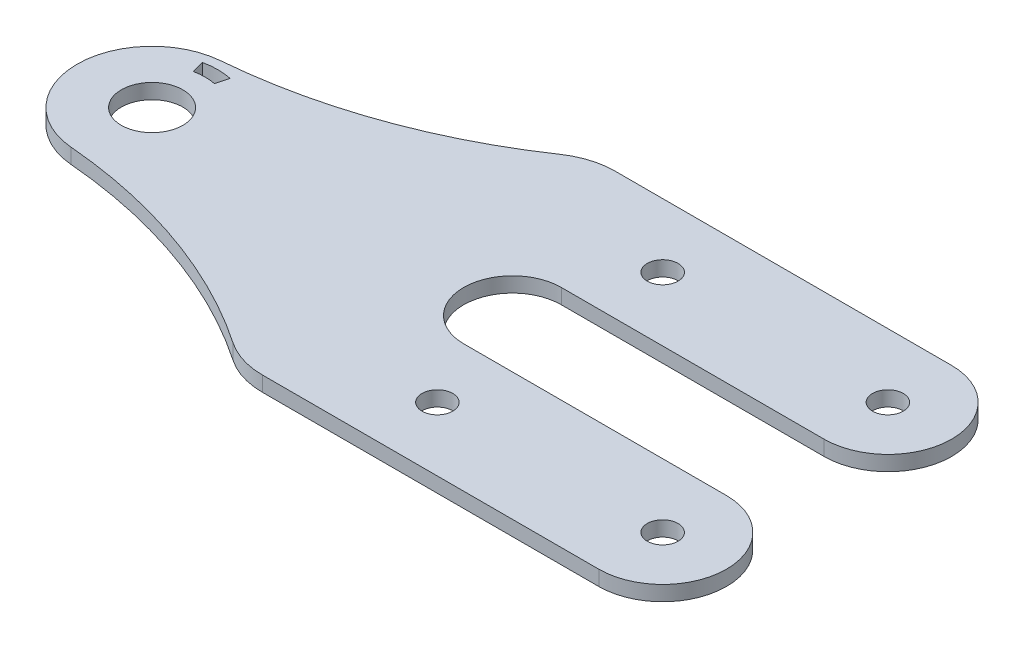
ISO-10303-21;
HEADER;
FILE_DESCRIPTION(('STEP AP214'),'2;1');
FILE_NAME('part.step','',(''),(''),'','','');
FILE_SCHEMA(('AUTOMOTIVE_DESIGN { 1 0 10303 214 1 1 1 1 }'));
ENDSEC;
DATA;
#1=APPLICATION_CONTEXT('core data for automotive mechanical design processes');
#2=APPLICATION_PROTOCOL_DEFINITION('international standard','automotive_design',2000,#1);
#3=PRODUCT_CONTEXT('',#1,'mechanical');
#4=PRODUCT('Part','Part','',(#3));
#5=PRODUCT_RELATED_PRODUCT_CATEGORY('part','',(#4));
#6=PRODUCT_DEFINITION_FORMATION('','',#4);
#7=PRODUCT_DEFINITION_CONTEXT('part definition',#1,'design');
#8=PRODUCT_DEFINITION('design','',#6,#7);
#9=PRODUCT_DEFINITION_SHAPE('','',#8);
#10=(LENGTH_UNIT() NAMED_UNIT(*) SI_UNIT(.MILLI.,.METRE.));
#11=(NAMED_UNIT(*) PLANE_ANGLE_UNIT() SI_UNIT($,.RADIAN.));
#12=(NAMED_UNIT(*) SI_UNIT($,.STERADIAN.) SOLID_ANGLE_UNIT());
#13=UNCERTAINTY_MEASURE_WITH_UNIT(LENGTH_MEASURE(1.E-05),#10,'distance_accuracy_value','');
#14=(GEOMETRIC_REPRESENTATION_CONTEXT(3) GLOBAL_UNCERTAINTY_ASSIGNED_CONTEXT((#13)) GLOBAL_UNIT_ASSIGNED_CONTEXT((#10,
#11,#12)) REPRESENTATION_CONTEXT('',''));
#15=CARTESIAN_POINT('',(0.,0.,0.));
#16=DIRECTION('',(0.,0.,1.));
#17=DIRECTION('',(1.,0.,0.));
#18=AXIS2_PLACEMENT_3D('',#15,#16,#17);
#19=CARTESIAN_POINT('',(0.,2.,0.));
#20=DIRECTION('',(0.,1.,0.));
#21=DIRECTION('',(0.,0.,1.));
#22=AXIS2_PLACEMENT_3D('',#19,#20,#21);
#23=PLANE('',#22);
#24=CARTESIAN_POINT('',(0.,2.,0.));
#25=DIRECTION('',(0.,1.,0.));
#26=DIRECTION('',(0.,0.,1.));
#27=AXIS2_PLACEMENT_3D('',#24,#25,#26);
#28=CIRCLE('',#27,8.75);
#29=CARTESIAN_POINT('',(1.84067203226459,2.,-8.55420519216362));
#30=VERTEX_POINT('',#29);
#31=CARTESIAN_POINT('',(-1.84067203226459,2.,-8.55420519216362));
#32=VERTEX_POINT('',#31);
#33=EDGE_CURVE('E155',#30,#32,#28,.T.);
#34=ORIENTED_EDGE('',*,*,#33,.F.);
#35=DIRECTION('',(0.258819045102521,0.,-0.965925826289068));
#36=VECTOR('',#35,1.);
#37=CARTESIAN_POINT('',(1.84067203226459,2.,-8.55420519216362));
#38=LINE('',#37,#36);
#39=CARTESIAN_POINT('',(1.4,2.,-6.90959477827752));
#40=VERTEX_POINT('',#39);
#41=EDGE_CURVE('E173',#40,#30,#38,.T.);
#42=ORIENTED_EDGE('',*,*,#41,.F.);
#43=CARTESIAN_POINT('',(0.,2.,0.));
#44=DIRECTION('',(0.,-1.,0.));
#45=DIRECTION('',(0.,0.,1.));
#46=AXIS2_PLACEMENT_3D('',#43,#44,#45);
#47=CIRCLE('',#46,7.05);
#48=CARTESIAN_POINT('',(-1.4,2.,-6.90959477827752));
#49=VERTEX_POINT('',#48);
#50=EDGE_CURVE('E176',#49,#40,#47,.T.);
#51=ORIENTED_EDGE('',*,*,#50,.F.);
#52=DIRECTION('',(0.258819045102521,0.,0.965925826289068));
#53=VECTOR('',#52,1.);
#54=CARTESIAN_POINT('',(-1.84067203226459,2.,-8.55420519216362));
#55=LINE('',#54,#53);
#56=EDGE_CURVE('E182',#32,#49,#55,.T.);
#57=ORIENTED_EDGE('',*,*,#56,.F.);
#58=EDGE_LOOP('',(#34,#42,#51,#57));
#59=FACE_BOUND('',#58,.T.);
#60=CARTESIAN_POINT('',(53.,2.,15.));
#61=DIRECTION('',(0.,1.,0.));
#62=DIRECTION('',(0.,0.,1.));
#63=AXIS2_PLACEMENT_3D('',#60,#61,#62);
#64=CIRCLE('',#63,2.05);
#65=CARTESIAN_POINT('',(53.,2.,17.05));
#66=VERTEX_POINT('',#65);
#67=EDGE_CURVE('E198',#66,#66,#64,.T.);
#68=ORIENTED_EDGE('',*,*,#67,.F.);
#69=EDGE_LOOP('',(#68));
#70=FACE_BOUND('',#69,.T.);
#71=CARTESIAN_POINT('',(53.,2.,-15.));
#72=DIRECTION('',(0.,1.,0.));
#73=DIRECTION('',(0.,0.,1.));
#74=AXIS2_PLACEMENT_3D('',#71,#72,#73);
#75=CIRCLE('',#74,2.04999999999999);
#76=CARTESIAN_POINT('',(53.,2.,-12.95));
#77=VERTEX_POINT('',#76);
#78=EDGE_CURVE('E210',#77,#77,#75,.T.);
#79=ORIENTED_EDGE('',*,*,#78,.F.);
#80=EDGE_LOOP('',(#79));
#81=FACE_BOUND('',#80,.T.);
#82=CARTESIAN_POINT('',(-6.70730685117692,2.,79.7183293528167));
#83=DIRECTION('',(0.,1.,0.));
#84=DIRECTION('',(0.,0.,1.));
#85=AXIS2_PLACEMENT_3D('',#82,#83,#84);
#86=CIRCLE('',#85,70.);
#87=CARTESIAN_POINT('',(-0.838413356397115,2.,9.96479116910209));
#88=VERTEX_POINT('',#87);
#89=CARTESIAN_POINT('',(32.5716454540123,2.,21.7772911691021));
#90=VERTEX_POINT('',#89);
#91=EDGE_CURVE('E285',#88,#90,#86,.F.);
#92=ORIENTED_EDGE('',*,*,#91,.T.);
#93=CARTESIAN_POINT('',(38.1829243547536,2.,13.5));
#94=DIRECTION('',(0.,1.,0.));
#95=DIRECTION('',(0.,0.,1.));
#96=AXIS2_PLACEMENT_3D('',#93,#94,#95);
#97=CIRCLE('',#96,10.);
#98=CARTESIAN_POINT('',(38.1829243547536,2.,23.5));
#99=VERTEX_POINT('',#98);
#100=EDGE_CURVE('E298',#90,#99,#97,.T.);
#101=ORIENTED_EDGE('',*,*,#100,.T.);
#102=DIRECTION('',(1.,0.,0.));
#103=VECTOR('',#102,1.);
#104=CARTESIAN_POINT('',(35.,2.,23.5));
#105=LINE('',#104,#103);
#106=CARTESIAN_POINT('',(83.,2.,23.5));
#107=VERTEX_POINT('',#106);
#108=EDGE_CURVE('E225',#99,#107,#105,.T.);
#109=ORIENTED_EDGE('',*,*,#108,.T.);
#110=CARTESIAN_POINT('',(83.,2.,15.));
#111=DIRECTION('',(0.,1.,0.));
#112=DIRECTION('',(0.,0.,1.));
#113=AXIS2_PLACEMENT_3D('',#110,#111,#112);
#114=CIRCLE('',#113,8.5);
#115=CARTESIAN_POINT('',(83.,2.,6.5));
#116=VERTEX_POINT('',#115);
#117=EDGE_CURVE('E228',#107,#116,#114,.T.);
#118=ORIENTED_EDGE('',*,*,#117,.T.);
#119=DIRECTION('',(-1.,0.,0.));
#120=VECTOR('',#119,1.);
#121=CARTESIAN_POINT('',(83.,2.,6.5));
#122=LINE('',#121,#120);
#123=CARTESIAN_POINT('',(48.,2.,6.50000000000001));
#124=VERTEX_POINT('',#123);
#125=EDGE_CURVE('E230',#116,#124,#122,.T.);
#126=ORIENTED_EDGE('',*,*,#125,.T.);
#127=CARTESIAN_POINT('',(48.,2.,0.));
#128=DIRECTION('',(0.,-1.,0.));
#129=DIRECTION('',(0.,0.,1.));
#130=AXIS2_PLACEMENT_3D('',#127,#128,#129);
#131=CIRCLE('',#130,6.5);
#132=CARTESIAN_POINT('',(48.,2.,-6.5));
#133=VERTEX_POINT('',#132);
#134=EDGE_CURVE('E232',#124,#133,#131,.T.);
#135=ORIENTED_EDGE('',*,*,#134,.T.);
#136=DIRECTION('',(1.,0.,0.));
#137=VECTOR('',#136,1.);
#138=CARTESIAN_POINT('',(83.,2.,-6.5));
#139=LINE('',#138,#137);
#140=CARTESIAN_POINT('',(83.,2.,-6.5));
#141=VERTEX_POINT('',#140);
#142=EDGE_CURVE('E234',#133,#141,#139,.T.);
#143=ORIENTED_EDGE('',*,*,#142,.T.);
#144=CARTESIAN_POINT('',(83.,2.,-15.));
#145=DIRECTION('',(0.,1.,0.));
#146=DIRECTION('',(0.,0.,1.));
#147=AXIS2_PLACEMENT_3D('',#144,#145,#146);
#148=CIRCLE('',#147,8.5);
#149=CARTESIAN_POINT('',(83.,2.,-23.5));
#150=VERTEX_POINT('',#149);
#151=EDGE_CURVE('E236',#141,#150,#148,.T.);
#152=ORIENTED_EDGE('',*,*,#151,.T.);
#153=DIRECTION('',(-1.,0.,0.));
#154=VECTOR('',#153,1.);
#155=CARTESIAN_POINT('',(35.,2.,-23.5));
#156=LINE('',#155,#154);
#157=CARTESIAN_POINT('',(38.1829243547536,2.,-23.5));
#158=VERTEX_POINT('',#157);
#159=EDGE_CURVE('E238',#150,#158,#156,.T.);
#160=ORIENTED_EDGE('',*,*,#159,.T.);
#161=CARTESIAN_POINT('',(38.1829243547536,2.,-13.5));
#162=DIRECTION('',(0.,1.,0.));
#163=DIRECTION('',(0.,0.,1.));
#164=AXIS2_PLACEMENT_3D('',#161,#162,#163);
#165=CIRCLE('',#164,10.);
#166=CARTESIAN_POINT('',(32.5716454540122,2.,-21.7772911691021));
#167=VERTEX_POINT('',#166);
#168=EDGE_CURVE('E50',#158,#167,#165,.T.);
#169=ORIENTED_EDGE('',*,*,#168,.T.);
#170=CARTESIAN_POINT('',(-6.70730685117692,2.,-79.7183293528167));
#171=DIRECTION('',(0.,1.,0.));
#172=DIRECTION('',(0.,0.,1.));
#173=AXIS2_PLACEMENT_3D('',#170,#171,#172);
#174=CIRCLE('',#173,70.);
#175=CARTESIAN_POINT('',(-0.838413356397115,2.,-9.96479116910209));
#176=VERTEX_POINT('',#175);
#177=EDGE_CURVE('E281',#167,#176,#174,.F.);
#178=ORIENTED_EDGE('',*,*,#177,.T.);
#179=CARTESIAN_POINT('',(0.,2.,0.));
#180=DIRECTION('',(0.,1.,0.));
#181=DIRECTION('',(0.,0.,1.));
#182=AXIS2_PLACEMENT_3D('',#179,#180,#181);
#183=CIRCLE('',#182,10.);
#184=EDGE_CURVE('E222',#176,#88,#183,.T.);
#185=ORIENTED_EDGE('',*,*,#184,.T.);
#186=EDGE_LOOP('',(#92,#101,#109,#118,#126,#135,#143,#152,#160,#169,#178,#185));
#187=FACE_BOUND('',#186,.T.);
#188=CARTESIAN_POINT('',(0.,2.,0.));
#189=DIRECTION('',(0.,1.,0.));
#190=DIRECTION('',(0.,0.,1.));
#191=AXIS2_PLACEMENT_3D('',#188,#189,#190);
#192=CIRCLE('',#191,4.1);
#193=CARTESIAN_POINT('',(0.,2.,4.1));
#194=VERTEX_POINT('',#193);
#195=EDGE_CURVE('E216',#194,#194,#192,.T.);
#196=ORIENTED_EDGE('',*,*,#195,.F.);
#197=EDGE_LOOP('',(#196));
#198=FACE_BOUND('',#197,.T.);
#199=CARTESIAN_POINT('',(83.,2.,-15.));
#200=DIRECTION('',(0.,1.,0.));
#201=DIRECTION('',(0.,0.,1.));
#202=AXIS2_PLACEMENT_3D('',#199,#200,#201);
#203=CIRCLE('',#202,2.04999999999999);
#204=CARTESIAN_POINT('',(83.,2.,-12.95));
#205=VERTEX_POINT('',#204);
#206=EDGE_CURVE('E204',#205,#205,#203,.T.);
#207=ORIENTED_EDGE('',*,*,#206,.F.);
#208=EDGE_LOOP('',(#207));
#209=FACE_BOUND('',#208,.T.);
#210=CARTESIAN_POINT('',(83.,2.,15.));
#211=DIRECTION('',(0.,1.,0.));
#212=DIRECTION('',(0.,0.,1.));
#213=AXIS2_PLACEMENT_3D('',#210,#211,#212);
#214=CIRCLE('',#213,2.04999999999999);
#215=CARTESIAN_POINT('',(83.,2.,17.05));
#216=VERTEX_POINT('',#215);
#217=EDGE_CURVE('E192',#216,#216,#214,.T.);
#218=ORIENTED_EDGE('',*,*,#217,.F.);
#219=EDGE_LOOP('',(#218));
#220=FACE_BOUND('',#219,.T.);
#221=ADVANCED_FACE('F35',(#59,#70,#81,#187,#198,#209,#220),#23,.T.);
#222=CARTESIAN_POINT('',(0.,0.,0.));
#223=DIRECTION('',(0.,1.,0.));
#224=DIRECTION('',(0.,0.,1.));
#225=AXIS2_PLACEMENT_3D('',#222,#223,#224);
#226=PLANE('',#225);
#227=DIRECTION('',(0.258819045102521,0.,-0.965925826289068));
#228=VECTOR('',#227,1.);
#229=CARTESIAN_POINT('',(1.84067203226459,0.,-8.55420519216362));
#230=LINE('',#229,#228);
#231=CARTESIAN_POINT('',(1.4,0.,-6.90959477827752));
#232=VERTEX_POINT('',#231);
#233=CARTESIAN_POINT('',(1.84067203226459,0.,-8.55420519216362));
#234=VERTEX_POINT('',#233);
#235=EDGE_CURVE('E160',#232,#234,#230,.T.);
#236=ORIENTED_EDGE('',*,*,#235,.T.);
#237=CARTESIAN_POINT('',(0.,0.,0.));
#238=DIRECTION('',(0.,1.,0.));
#239=DIRECTION('',(0.,0.,1.));
#240=AXIS2_PLACEMENT_3D('',#237,#238,#239);
#241=CIRCLE('',#240,8.75);
#242=CARTESIAN_POINT('',(-1.84067203226459,0.,-8.55420519216362));
#243=VERTEX_POINT('',#242);
#244=EDGE_CURVE('E152',#234,#243,#241,.T.);
#245=ORIENTED_EDGE('',*,*,#244,.T.);
#246=DIRECTION('',(0.258819045102521,0.,0.965925826289068));
#247=VECTOR('',#246,1.);
#248=CARTESIAN_POINT('',(-1.84067203226459,0.,-8.55420519216362));
#249=LINE('',#248,#247);
#250=CARTESIAN_POINT('',(-1.4,0.,-6.90959477827752));
#251=VERTEX_POINT('',#250);
#252=EDGE_CURVE('E164',#243,#251,#249,.T.);
#253=ORIENTED_EDGE('',*,*,#252,.T.);
#254=CARTESIAN_POINT('',(0.,0.,0.));
#255=DIRECTION('',(0.,-1.,0.));
#256=DIRECTION('',(0.,0.,1.));
#257=AXIS2_PLACEMENT_3D('',#254,#255,#256);
#258=CIRCLE('',#257,7.05);
#259=EDGE_CURVE('E168',#251,#232,#258,.T.);
#260=ORIENTED_EDGE('',*,*,#259,.T.);
#261=EDGE_LOOP('',(#236,#245,#253,#260));
#262=FACE_BOUND('',#261,.T.);
#263=DIRECTION('',(1.,0.,0.));
#264=VECTOR('',#263,1.);
#265=CARTESIAN_POINT('',(35.,0.,23.5));
#266=LINE('',#265,#264);
#267=CARTESIAN_POINT('',(38.1829243547536,0.,23.5));
#268=VERTEX_POINT('',#267);
#269=CARTESIAN_POINT('',(83.,0.,23.5));
#270=VERTEX_POINT('',#269);
#271=EDGE_CURVE('E243',#268,#270,#266,.T.);
#272=ORIENTED_EDGE('',*,*,#271,.F.);
#273=CARTESIAN_POINT('',(38.1829243547536,0.,13.5));
#274=DIRECTION('',(0.,1.,0.));
#275=DIRECTION('',(0.,0.,1.));
#276=AXIS2_PLACEMENT_3D('',#273,#274,#275);
#277=CIRCLE('',#276,10.);
#278=CARTESIAN_POINT('',(32.5716454540123,0.,21.7772911691021));
#279=VERTEX_POINT('',#278);
#280=EDGE_CURVE('E293',#268,#279,#277,.F.);
#281=ORIENTED_EDGE('',*,*,#280,.T.);
#282=CARTESIAN_POINT('',(-6.70730685117692,0.,79.7183293528167));
#283=DIRECTION('',(0.,1.,0.));
#284=DIRECTION('',(0.,0.,1.));
#285=AXIS2_PLACEMENT_3D('',#282,#283,#284);
#286=CIRCLE('',#285,70.);
#287=CARTESIAN_POINT('',(-0.838413356397115,0.,9.96479116910209));
#288=VERTEX_POINT('',#287);
#289=EDGE_CURVE('E283',#279,#288,#286,.T.);
#290=ORIENTED_EDGE('',*,*,#289,.T.);
#291=CARTESIAN_POINT('',(0.,0.,0.));
#292=DIRECTION('',(0.,1.,0.));
#293=DIRECTION('',(0.,0.,1.));
#294=AXIS2_PLACEMENT_3D('',#291,#292,#293);
#295=CIRCLE('',#294,10.);
#296=CARTESIAN_POINT('',(-0.838413356397115,0.,-9.96479116910209));
#297=VERTEX_POINT('',#296);
#298=EDGE_CURVE('E219',#297,#288,#295,.T.);
#299=ORIENTED_EDGE('',*,*,#298,.F.);
#300=CARTESIAN_POINT('',(-6.70730685117692,0.,-79.7183293528167));
#301=DIRECTION('',(0.,1.,0.));
#302=DIRECTION('',(0.,0.,1.));
#303=AXIS2_PLACEMENT_3D('',#300,#301,#302);
#304=CIRCLE('',#303,70.);
#305=CARTESIAN_POINT('',(32.5716454540122,0.,-21.7772911691021));
#306=VERTEX_POINT('',#305);
#307=EDGE_CURVE('E278',#297,#306,#304,.T.);
#308=ORIENTED_EDGE('',*,*,#307,.T.);
#309=CARTESIAN_POINT('',(38.1829243547536,0.,-13.5));
#310=DIRECTION('',(0.,1.,0.));
#311=DIRECTION('',(0.,0.,1.));
#312=AXIS2_PLACEMENT_3D('',#309,#310,#311);
#313=CIRCLE('',#312,10.);
#314=CARTESIAN_POINT('',(38.1829243547536,0.,-23.5));
#315=VERTEX_POINT('',#314);
#316=EDGE_CURVE('E291',#306,#315,#313,.F.);
#317=ORIENTED_EDGE('',*,*,#316,.T.);
#318=DIRECTION('',(-1.,0.,0.));
#319=VECTOR('',#318,1.);
#320=CARTESIAN_POINT('',(35.,0.,-23.5));
#321=LINE('',#320,#319);
#322=CARTESIAN_POINT('',(83.,0.,-23.5));
#323=VERTEX_POINT('',#322);
#324=EDGE_CURVE('E226',#323,#315,#321,.T.);
#325=ORIENTED_EDGE('',*,*,#324,.F.);
#326=CARTESIAN_POINT('',(83.,0.,-15.));
#327=DIRECTION('',(0.,1.,0.));
#328=DIRECTION('',(0.,0.,1.));
#329=AXIS2_PLACEMENT_3D('',#326,#327,#328);
#330=CIRCLE('',#329,8.5);
#331=CARTESIAN_POINT('',(83.,0.,-6.5));
#332=VERTEX_POINT('',#331);
#333=EDGE_CURVE('E253',#332,#323,#330,.T.);
#334=ORIENTED_EDGE('',*,*,#333,.F.);
#335=DIRECTION('',(1.,0.,0.));
#336=VECTOR('',#335,1.);
#337=CARTESIAN_POINT('',(83.,0.,-6.5));
#338=LINE('',#337,#336);
#339=CARTESIAN_POINT('',(48.,0.,-6.5));
#340=VERTEX_POINT('',#339);
#341=EDGE_CURVE('E251',#340,#332,#338,.T.);
#342=ORIENTED_EDGE('',*,*,#341,.F.);
#343=CARTESIAN_POINT('',(48.,0.,0.));
#344=DIRECTION('',(0.,-1.,0.));
#345=DIRECTION('',(0.,0.,1.));
#346=AXIS2_PLACEMENT_3D('',#343,#344,#345);
#347=CIRCLE('',#346,6.5);
#348=CARTESIAN_POINT('',(48.,0.,6.50000000000001));
#349=VERTEX_POINT('',#348);
#350=EDGE_CURVE('E249',#349,#340,#347,.T.);
#351=ORIENTED_EDGE('',*,*,#350,.F.);
#352=DIRECTION('',(-1.,0.,0.));
#353=VECTOR('',#352,1.);
#354=CARTESIAN_POINT('',(83.,0.,6.5));
#355=LINE('',#354,#353);
#356=CARTESIAN_POINT('',(83.,0.,6.5));
#357=VERTEX_POINT('',#356);
#358=EDGE_CURVE('E247',#357,#349,#355,.T.);
#359=ORIENTED_EDGE('',*,*,#358,.F.);
#360=CARTESIAN_POINT('',(83.,0.,15.));
#361=DIRECTION('',(0.,1.,0.));
#362=DIRECTION('',(0.,0.,1.));
#363=AXIS2_PLACEMENT_3D('',#360,#361,#362);
#364=CIRCLE('',#363,8.5);
#365=EDGE_CURVE('E245',#270,#357,#364,.T.);
#366=ORIENTED_EDGE('',*,*,#365,.F.);
#367=EDGE_LOOP('',(#272,#281,#290,#299,#308,#317,#325,#334,#342,#351,#359,#366));
#368=FACE_BOUND('',#367,.T.);
#369=CARTESIAN_POINT('',(0.,0.,0.));
#370=DIRECTION('',(0.,1.,0.));
#371=DIRECTION('',(0.,0.,1.));
#372=AXIS2_PLACEMENT_3D('',#369,#370,#371);
#373=CIRCLE('',#372,4.1);
#374=CARTESIAN_POINT('',(0.,0.,4.1));
#375=VERTEX_POINT('',#374);
#376=EDGE_CURVE('E213',#375,#375,#373,.T.);
#377=ORIENTED_EDGE('',*,*,#376,.T.);
#378=EDGE_LOOP('',(#377));
#379=FACE_BOUND('',#378,.T.);
#380=CARTESIAN_POINT('',(53.,0.,-15.));
#381=DIRECTION('',(0.,1.,0.));
#382=DIRECTION('',(0.,0.,1.));
#383=AXIS2_PLACEMENT_3D('',#380,#381,#382);
#384=CIRCLE('',#383,2.04999999999999);
#385=CARTESIAN_POINT('',(53.,0.,-12.95));
#386=VERTEX_POINT('',#385);
#387=EDGE_CURVE('E207',#386,#386,#384,.T.);
#388=ORIENTED_EDGE('',*,*,#387,.T.);
#389=EDGE_LOOP('',(#388));
#390=FACE_BOUND('',#389,.T.);
#391=CARTESIAN_POINT('',(83.,0.,-15.));
#392=DIRECTION('',(0.,1.,0.));
#393=DIRECTION('',(0.,0.,1.));
#394=AXIS2_PLACEMENT_3D('',#391,#392,#393);
#395=CIRCLE('',#394,2.04999999999999);
#396=CARTESIAN_POINT('',(83.,0.,-12.95));
#397=VERTEX_POINT('',#396);
#398=EDGE_CURVE('E201',#397,#397,#395,.T.);
#399=ORIENTED_EDGE('',*,*,#398,.T.);
#400=EDGE_LOOP('',(#399));
#401=FACE_BOUND('',#400,.T.);
#402=CARTESIAN_POINT('',(53.,0.,15.));
#403=DIRECTION('',(0.,1.,0.));
#404=DIRECTION('',(0.,0.,1.));
#405=AXIS2_PLACEMENT_3D('',#402,#403,#404);
#406=CIRCLE('',#405,2.05);
#407=CARTESIAN_POINT('',(53.,0.,17.05));
#408=VERTEX_POINT('',#407);
#409=EDGE_CURVE('E195',#408,#408,#406,.T.);
#410=ORIENTED_EDGE('',*,*,#409,.T.);
#411=EDGE_LOOP('',(#410));
#412=FACE_BOUND('',#411,.T.);
#413=CARTESIAN_POINT('',(83.,0.,15.));
#414=DIRECTION('',(0.,1.,0.));
#415=DIRECTION('',(0.,0.,1.));
#416=AXIS2_PLACEMENT_3D('',#413,#414,#415);
#417=CIRCLE('',#416,2.04999999999999);
#418=CARTESIAN_POINT('',(83.,0.,17.05));
#419=VERTEX_POINT('',#418);
#420=EDGE_CURVE('E188',#419,#419,#417,.T.);
#421=ORIENTED_EDGE('',*,*,#420,.T.);
#422=EDGE_LOOP('',(#421));
#423=FACE_BOUND('',#422,.T.);
#424=ADVANCED_FACE('F170',(#262,#368,#379,#390,#401,#412,#423),#226,.F.);
#425=CARTESIAN_POINT('',(0.,2.,0.));
#426=DIRECTION('',(0.,-1.,0.));
#427=DIRECTION('',(0.,0.,-1.));
#428=AXIS2_PLACEMENT_3D('',#425,#426,#427);
#429=CYLINDRICAL_SURFACE('',#428,10.);
#430=ORIENTED_EDGE('',*,*,#184,.F.);
#431=DIRECTION('',(0.,-1.,0.));
#432=VECTOR('',#431,1.);
#433=CARTESIAN_POINT('',(-0.838413356397115,2.,-9.96479116910209));
#434=LINE('',#433,#432);
#435=EDGE_CURVE('E275',#176,#297,#434,.T.);
#436=ORIENTED_EDGE('',*,*,#435,.T.);
#437=ORIENTED_EDGE('',*,*,#298,.T.);
#438=DIRECTION('',(0.,-1.,0.));
#439=VECTOR('',#438,1.);
#440=CARTESIAN_POINT('',(-0.838413356397115,2.,9.96479116910209));
#441=LINE('',#440,#439);
#442=EDGE_CURVE('E273',#288,#88,#441,.F.);
#443=ORIENTED_EDGE('',*,*,#442,.T.);
#444=EDGE_LOOP('',(#430,#436,#437,#443));
#445=FACE_BOUND('',#444,.T.);
#446=ADVANCED_FACE('F313',(#445),#429,.T.);
#447=CARTESIAN_POINT('',(35.,2.,23.5));
#448=DIRECTION('',(0.,0.,-1.));
#449=DIRECTION('',(-1.,0.,0.));
#450=AXIS2_PLACEMENT_3D('',#447,#448,#449);
#451=PLANE('',#450);
#452=ORIENTED_EDGE('',*,*,#108,.F.);
#453=DIRECTION('',(0.,1.,0.));
#454=VECTOR('',#453,1.);
#455=CARTESIAN_POINT('',(38.1829243547536,2.,23.5));
#456=LINE('',#455,#454);
#457=EDGE_CURVE('E288',#99,#268,#456,.F.);
#458=ORIENTED_EDGE('',*,*,#457,.T.);
#459=ORIENTED_EDGE('',*,*,#271,.T.);
#460=DIRECTION('',(0.,-1.,0.));
#461=VECTOR('',#460,1.);
#462=CARTESIAN_POINT('',(83.,2.,23.5));
#463=LINE('',#462,#461);
#464=EDGE_CURVE('E270',#107,#270,#463,.T.);
#465=ORIENTED_EDGE('',*,*,#464,.F.);
#466=EDGE_LOOP('',(#452,#458,#459,#465));
#467=FACE_BOUND('',#466,.T.);
#468=ADVANCED_FACE('F325',(#467),#451,.F.);
#469=CARTESIAN_POINT('',(83.,2.,15.));
#470=DIRECTION('',(0.,-1.,0.));
#471=DIRECTION('',(0.,0.,-1.));
#472=AXIS2_PLACEMENT_3D('',#469,#470,#471);
#473=CYLINDRICAL_SURFACE('',#472,8.5);
#474=ORIENTED_EDGE('',*,*,#365,.T.);
#475=DIRECTION('',(0.,-1.,0.));
#476=VECTOR('',#475,1.);
#477=CARTESIAN_POINT('',(83.,2.,6.5));
#478=LINE('',#477,#476);
#479=EDGE_CURVE('E267',#116,#357,#478,.T.);
#480=ORIENTED_EDGE('',*,*,#479,.F.);
#481=ORIENTED_EDGE('',*,*,#117,.F.);
#482=ORIENTED_EDGE('',*,*,#464,.T.);
#483=EDGE_LOOP('',(#474,#480,#481,#482));
#484=FACE_BOUND('',#483,.T.);
#485=ADVANCED_FACE('F332',(#484),#473,.T.);
#486=CARTESIAN_POINT('',(83.,2.,6.5));
#487=DIRECTION('',(0.,0.,1.));
#488=DIRECTION('',(1.,0.,0.));
#489=AXIS2_PLACEMENT_3D('',#486,#487,#488);
#490=PLANE('',#489);
#491=ORIENTED_EDGE('',*,*,#358,.T.);
#492=DIRECTION('',(0.,-1.,0.));
#493=VECTOR('',#492,1.);
#494=CARTESIAN_POINT('',(48.,2.,6.50000000000001));
#495=LINE('',#494,#493);
#496=EDGE_CURVE('E264',#124,#349,#495,.T.);
#497=ORIENTED_EDGE('',*,*,#496,.F.);
#498=ORIENTED_EDGE('',*,*,#125,.F.);
#499=ORIENTED_EDGE('',*,*,#479,.T.);
#500=EDGE_LOOP('',(#491,#497,#498,#499));
#501=FACE_BOUND('',#500,.T.);
#502=ADVANCED_FACE('F336',(#501),#490,.F.);
#503=CARTESIAN_POINT('',(48.,2.,0.));
#504=DIRECTION('',(0.,-1.,0.));
#505=DIRECTION('',(0.,0.,-1.));
#506=AXIS2_PLACEMENT_3D('',#503,#504,#505);
#507=CYLINDRICAL_SURFACE('',#506,6.5);
#508=ORIENTED_EDGE('',*,*,#350,.T.);
#509=DIRECTION('',(0.,-1.,0.));
#510=VECTOR('',#509,1.);
#511=CARTESIAN_POINT('',(48.,2.,-6.5));
#512=LINE('',#511,#510);
#513=EDGE_CURVE('E261',#133,#340,#512,.T.);
#514=ORIENTED_EDGE('',*,*,#513,.F.);
#515=ORIENTED_EDGE('',*,*,#134,.F.);
#516=ORIENTED_EDGE('',*,*,#496,.T.);
#517=EDGE_LOOP('',(#508,#514,#515,#516));
#518=FACE_BOUND('',#517,.T.);
#519=ADVANCED_FACE('F343',(#518),#507,.F.);
#520=CARTESIAN_POINT('',(83.,2.,-6.5));
#521=DIRECTION('',(0.,0.,-1.));
#522=DIRECTION('',(-1.,0.,0.));
#523=AXIS2_PLACEMENT_3D('',#520,#521,#522);
#524=PLANE('',#523);
#525=ORIENTED_EDGE('',*,*,#341,.T.);
#526=DIRECTION('',(0.,-1.,0.));
#527=VECTOR('',#526,1.);
#528=CARTESIAN_POINT('',(83.,2.,-6.5));
#529=LINE('',#528,#527);
#530=EDGE_CURVE('E258',#141,#332,#529,.T.);
#531=ORIENTED_EDGE('',*,*,#530,.F.);
#532=ORIENTED_EDGE('',*,*,#142,.F.);
#533=ORIENTED_EDGE('',*,*,#513,.T.);
#534=EDGE_LOOP('',(#525,#531,#532,#533));
#535=FACE_BOUND('',#534,.T.);
#536=ADVANCED_FACE('F346',(#535),#524,.F.);
#537=CARTESIAN_POINT('',(83.,2.,-15.));
#538=DIRECTION('',(0.,-1.,0.));
#539=DIRECTION('',(0.,0.,-1.));
#540=AXIS2_PLACEMENT_3D('',#537,#538,#539);
#541=CYLINDRICAL_SURFACE('',#540,8.5);
#542=ORIENTED_EDGE('',*,*,#333,.T.);
#543=DIRECTION('',(0.,-1.,0.));
#544=VECTOR('',#543,1.);
#545=CARTESIAN_POINT('',(83.,2.,-23.5));
#546=LINE('',#545,#544);
#547=EDGE_CURVE('E240',#150,#323,#546,.T.);
#548=ORIENTED_EDGE('',*,*,#547,.F.);
#549=ORIENTED_EDGE('',*,*,#151,.F.);
#550=ORIENTED_EDGE('',*,*,#530,.T.);
#551=EDGE_LOOP('',(#542,#548,#549,#550));
#552=FACE_BOUND('',#551,.T.);
#553=ADVANCED_FACE('F351',(#552),#541,.T.);
#554=CARTESIAN_POINT('',(35.,2.,-23.5));
#555=DIRECTION('',(0.,0.,1.));
#556=DIRECTION('',(1.,0.,0.));
#557=AXIS2_PLACEMENT_3D('',#554,#555,#556);
#558=PLANE('',#557);
#559=ORIENTED_EDGE('',*,*,#324,.T.);
#560=DIRECTION('',(0.,1.,0.));
#561=VECTOR('',#560,1.);
#562=CARTESIAN_POINT('',(38.1829243547536,2.,-23.5));
#563=LINE('',#562,#561);
#564=EDGE_CURVE('E11',#315,#158,#563,.T.);
#565=ORIENTED_EDGE('',*,*,#564,.T.);
#566=ORIENTED_EDGE('',*,*,#159,.F.);
#567=ORIENTED_EDGE('',*,*,#547,.T.);
#568=EDGE_LOOP('',(#559,#565,#566,#567));
#569=FACE_BOUND('',#568,.T.);
#570=ADVANCED_FACE('F368',(#569),#558,.F.);
#571=CARTESIAN_POINT('',(0.,2.,0.));
#572=DIRECTION('',(0.,-1.,0.));
#573=DIRECTION('',(0.,0.,-1.));
#574=AXIS2_PLACEMENT_3D('',#571,#572,#573);
#575=CYLINDRICAL_SURFACE('',#574,4.1);
#576=ORIENTED_EDGE('',*,*,#195,.T.);
#577=EDGE_LOOP('',(#576));
#578=FACE_BOUND('',#577,.T.);
#579=ORIENTED_EDGE('',*,*,#376,.F.);
#580=EDGE_LOOP('',(#579));
#581=FACE_BOUND('',#580,.T.);
#582=ADVANCED_FACE('F365',(#578,#581),#575,.F.);
#583=CARTESIAN_POINT('',(53.,2.,-15.));
#584=DIRECTION('',(0.,-1.,0.));
#585=DIRECTION('',(0.,0.,-1.));
#586=AXIS2_PLACEMENT_3D('',#583,#584,#585);
#587=CYLINDRICAL_SURFACE('',#586,2.04999999999999);
#588=ORIENTED_EDGE('',*,*,#78,.T.);
#589=EDGE_LOOP('',(#588));
#590=FACE_BOUND('',#589,.T.);
#591=ORIENTED_EDGE('',*,*,#387,.F.);
#592=EDGE_LOOP('',(#591));
#593=FACE_BOUND('',#592,.T.);
#594=ADVANCED_FACE('F469',(#590,#593),#587,.F.);
#595=CARTESIAN_POINT('',(83.,2.,-15.));
#596=DIRECTION('',(0.,-1.,0.));
#597=DIRECTION('',(0.,0.,-1.));
#598=AXIS2_PLACEMENT_3D('',#595,#596,#597);
#599=CYLINDRICAL_SURFACE('',#598,2.04999999999999);
#600=ORIENTED_EDGE('',*,*,#206,.T.);
#601=EDGE_LOOP('',(#600));
#602=FACE_BOUND('',#601,.T.);
#603=ORIENTED_EDGE('',*,*,#398,.F.);
#604=EDGE_LOOP('',(#603));
#605=FACE_BOUND('',#604,.T.);
#606=ADVANCED_FACE('F460',(#602,#605),#599,.F.);
#607=CARTESIAN_POINT('',(53.,2.,15.));
#608=DIRECTION('',(0.,-1.,0.));
#609=DIRECTION('',(0.,0.,-1.));
#610=AXIS2_PLACEMENT_3D('',#607,#608,#609);
#611=CYLINDRICAL_SURFACE('',#610,2.05);
#612=ORIENTED_EDGE('',*,*,#67,.T.);
#613=EDGE_LOOP('',(#612));
#614=FACE_BOUND('',#613,.T.);
#615=ORIENTED_EDGE('',*,*,#409,.F.);
#616=EDGE_LOOP('',(#615));
#617=FACE_BOUND('',#616,.T.);
#618=ADVANCED_FACE('F451',(#614,#617),#611,.F.);
#619=CARTESIAN_POINT('',(83.,2.,15.));
#620=DIRECTION('',(0.,-1.,0.));
#621=DIRECTION('',(0.,0.,-1.));
#622=AXIS2_PLACEMENT_3D('',#619,#620,#621);
#623=CYLINDRICAL_SURFACE('',#622,2.04999999999999);
#624=ORIENTED_EDGE('',*,*,#217,.T.);
#625=EDGE_LOOP('',(#624));
#626=FACE_BOUND('',#625,.T.);
#627=ORIENTED_EDGE('',*,*,#420,.F.);
#628=EDGE_LOOP('',(#627));
#629=FACE_BOUND('',#628,.T.);
#630=ADVANCED_FACE('F443',(#626,#629),#623,.F.);
#631=CARTESIAN_POINT('',(0.,0.,0.));
#632=DIRECTION('',(0.,1.,0.));
#633=DIRECTION('',(0.,0.,1.));
#634=AXIS2_PLACEMENT_3D('',#631,#632,#633);
#635=CYLINDRICAL_SURFACE('',#634,8.75);
#636=ORIENTED_EDGE('',*,*,#33,.T.);
#637=DIRECTION('',(0.,1.,0.));
#638=VECTOR('',#637,1.);
#639=CARTESIAN_POINT('',(-1.84067203226459,0.,-8.55420519216362));
#640=LINE('',#639,#638);
#641=EDGE_CURVE('E148',#243,#32,#640,.T.);
#642=ORIENTED_EDGE('',*,*,#641,.F.);
#643=ORIENTED_EDGE('',*,*,#244,.F.);
#644=DIRECTION('',(0.,1.,0.));
#645=VECTOR('',#644,1.);
#646=CARTESIAN_POINT('',(1.84067203226459,0.,-8.55420519216362));
#647=LINE('',#646,#645);
#648=EDGE_CURVE('E186',#234,#30,#647,.T.);
#649=ORIENTED_EDGE('',*,*,#648,.T.);
#650=EDGE_LOOP('',(#636,#642,#643,#649));
#651=FACE_BOUND('',#650,.T.);
#652=ADVANCED_FACE('F150',(#651),#635,.F.);
#653=CARTESIAN_POINT('',(1.84067203226459,0.,-8.55420519216362));
#654=DIRECTION('',(0.965925826289068,0.,0.258819045102521));
#655=DIRECTION('',(0.258819045102521,0.,-0.965925826289068));
#656=AXIS2_PLACEMENT_3D('',#653,#654,#655);
#657=PLANE('',#656);
#658=ORIENTED_EDGE('',*,*,#41,.T.);
#659=ORIENTED_EDGE('',*,*,#648,.F.);
#660=ORIENTED_EDGE('',*,*,#235,.F.);
#661=DIRECTION('',(0.,1.,0.));
#662=VECTOR('',#661,1.);
#663=CARTESIAN_POINT('',(1.4,0.,-6.90959477827752));
#664=LINE('',#663,#662);
#665=EDGE_CURVE('E189',#232,#40,#664,.T.);
#666=ORIENTED_EDGE('',*,*,#665,.T.);
#667=EDGE_LOOP('',(#658,#659,#660,#666));
#668=FACE_BOUND('',#667,.T.);
#669=ADVANCED_FACE('F426',(#668),#657,.F.);
#670=CARTESIAN_POINT('',(0.,0.,0.));
#671=DIRECTION('',(0.,1.,0.));
#672=DIRECTION('',(0.,0.,1.));
#673=AXIS2_PLACEMENT_3D('',#670,#671,#672);
#674=CYLINDRICAL_SURFACE('',#673,7.05);
#675=ORIENTED_EDGE('',*,*,#50,.T.);
#676=ORIENTED_EDGE('',*,*,#665,.F.);
#677=ORIENTED_EDGE('',*,*,#259,.F.);
#678=DIRECTION('',(0.,1.,0.));
#679=VECTOR('',#678,1.);
#680=CARTESIAN_POINT('',(-1.4,0.,-6.90959477827752));
#681=LINE('',#680,#679);
#682=EDGE_CURVE('E159',#251,#49,#681,.T.);
#683=ORIENTED_EDGE('',*,*,#682,.T.);
#684=EDGE_LOOP('',(#675,#676,#677,#683));
#685=FACE_BOUND('',#684,.T.);
#686=ADVANCED_FACE('F417',(#685),#674,.T.);
#687=CARTESIAN_POINT('',(-1.84067203226459,0.,-8.55420519216362));
#688=DIRECTION('',(-0.965925826289068,0.,0.258819045102521));
#689=DIRECTION('',(0.258819045102521,0.,0.965925826289068));
#690=AXIS2_PLACEMENT_3D('',#687,#688,#689);
#691=PLANE('',#690);
#692=ORIENTED_EDGE('',*,*,#56,.T.);
#693=ORIENTED_EDGE('',*,*,#682,.F.);
#694=ORIENTED_EDGE('',*,*,#252,.F.);
#695=ORIENTED_EDGE('',*,*,#641,.T.);
#696=EDGE_LOOP('',(#692,#693,#694,#695));
#697=FACE_BOUND('',#696,.T.);
#698=ADVANCED_FACE('F165',(#697),#691,.F.);
#699=CARTESIAN_POINT('',(-6.70730685117692,2.,-79.7183293528167));
#700=DIRECTION('',(0.,1.,0.));
#701=DIRECTION('',(0.,0.,1.));
#702=AXIS2_PLACEMENT_3D('',#699,#700,#701);
#703=CYLINDRICAL_SURFACE('',#702,70.);
#704=ORIENTED_EDGE('',*,*,#177,.F.);
#705=DIRECTION('',(0.,1.,0.));
#706=VECTOR('',#705,1.);
#707=CARTESIAN_POINT('',(32.5716454540122,2.,-21.7772911691021));
#708=LINE('',#707,#706);
#709=EDGE_CURVE('E43',#167,#306,#708,.F.);
#710=ORIENTED_EDGE('',*,*,#709,.T.);
#711=ORIENTED_EDGE('',*,*,#307,.F.);
#712=ORIENTED_EDGE('',*,*,#435,.F.);
#713=EDGE_LOOP('',(#704,#710,#711,#712));
#714=FACE_BOUND('',#713,.T.);
#715=ADVANCED_FACE('F302',(#714),#703,.F.);
#716=CARTESIAN_POINT('',(-6.70730685117692,2.,79.7183293528167));
#717=DIRECTION('',(0.,1.,0.));
#718=DIRECTION('',(0.,0.,1.));
#719=AXIS2_PLACEMENT_3D('',#716,#717,#718);
#720=CYLINDRICAL_SURFACE('',#719,70.);
#721=ORIENTED_EDGE('',*,*,#289,.F.);
#722=DIRECTION('',(0.,1.,0.));
#723=VECTOR('',#722,1.);
#724=CARTESIAN_POINT('',(32.5716454540123,2.,21.7772911691021));
#725=LINE('',#724,#723);
#726=EDGE_CURVE('E295',#279,#90,#725,.T.);
#727=ORIENTED_EDGE('',*,*,#726,.T.);
#728=ORIENTED_EDGE('',*,*,#91,.F.);
#729=ORIENTED_EDGE('',*,*,#442,.F.);
#730=EDGE_LOOP('',(#721,#727,#728,#729));
#731=FACE_BOUND('',#730,.T.);
#732=ADVANCED_FACE('F316',(#731),#720,.F.);
#733=CARTESIAN_POINT('',(38.1829243547536,2.,13.5));
#734=DIRECTION('',(0.,1.,0.));
#735=DIRECTION('',(0.,0.,1.));
#736=AXIS2_PLACEMENT_3D('',#733,#734,#735);
#737=CYLINDRICAL_SURFACE('',#736,10.);
#738=ORIENTED_EDGE('',*,*,#100,.F.);
#739=ORIENTED_EDGE('',*,*,#726,.F.);
#740=ORIENTED_EDGE('',*,*,#280,.F.);
#741=ORIENTED_EDGE('',*,*,#457,.F.);
#742=EDGE_LOOP('',(#738,#739,#740,#741));
#743=FACE_BOUND('',#742,.T.);
#744=ADVANCED_FACE('F323',(#743),#737,.T.);
#745=CARTESIAN_POINT('',(38.1829243547536,2.,-13.5));
#746=DIRECTION('',(0.,1.,0.));
#747=DIRECTION('',(0.,0.,1.));
#748=AXIS2_PLACEMENT_3D('',#745,#746,#747);
#749=CYLINDRICAL_SURFACE('',#748,10.);
#750=ORIENTED_EDGE('',*,*,#168,.F.);
#751=ORIENTED_EDGE('',*,*,#564,.F.);
#752=ORIENTED_EDGE('',*,*,#316,.F.);
#753=ORIENTED_EDGE('',*,*,#709,.F.);
#754=EDGE_LOOP('',(#750,#751,#752,#753));
#755=FACE_BOUND('',#754,.T.);
#756=ADVANCED_FACE('F37',(#755),#749,.T.);
#757=CLOSED_SHELL('',(#221,#424,#446,#468,#485,#502,#519,#536,#553,#570,#582,#594,#606,#618,
#630,#652,#669,#686,#698,#715,#732,#744,#756));
#758=MANIFOLD_SOLID_BREP('B2',#757);
#759=ADVANCED_BREP_SHAPE_REPRESENTATION('',(#18,#758),#14);
#760=SHAPE_DEFINITION_REPRESENTATION(#9,#759);
ENDSEC;
END-ISO-10303-21;
